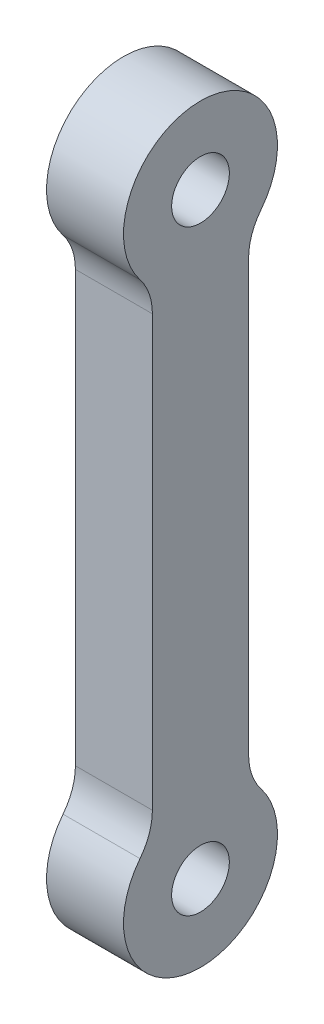
ISO-10303-21;
HEADER;
FILE_DESCRIPTION(('STEP AP214'),'2;1');
FILE_NAME('part.step','',(''),(''),'','','');
FILE_SCHEMA(('AUTOMOTIVE_DESIGN { 1 0 10303 214 1 1 1 1 }'));
ENDSEC;
DATA;
#1=APPLICATION_CONTEXT('core data for automotive mechanical design processes');
#2=APPLICATION_PROTOCOL_DEFINITION('international standard','automotive_design',2000,#1);
#3=PRODUCT_CONTEXT('',#1,'mechanical');
#4=PRODUCT('Part','Part','',(#3));
#5=PRODUCT_RELATED_PRODUCT_CATEGORY('part','',(#4));
#6=PRODUCT_DEFINITION_FORMATION('','',#4);
#7=PRODUCT_DEFINITION_CONTEXT('part definition',#1,'design');
#8=PRODUCT_DEFINITION('design','',#6,#7);
#9=PRODUCT_DEFINITION_SHAPE('','',#8);
#10=(LENGTH_UNIT() NAMED_UNIT(*) SI_UNIT(.MILLI.,.METRE.));
#11=(NAMED_UNIT(*) PLANE_ANGLE_UNIT() SI_UNIT($,.RADIAN.));
#12=(NAMED_UNIT(*) SI_UNIT($,.STERADIAN.) SOLID_ANGLE_UNIT());
#13=UNCERTAINTY_MEASURE_WITH_UNIT(LENGTH_MEASURE(1.E-05),#10,'distance_accuracy_value','');
#14=(GEOMETRIC_REPRESENTATION_CONTEXT(3) GLOBAL_UNCERTAINTY_ASSIGNED_CONTEXT((#13)) GLOBAL_UNIT_ASSIGNED_CONTEXT((#10,
#11,#12)) REPRESENTATION_CONTEXT('',''));
#15=CARTESIAN_POINT('',(0.,0.,0.));
#16=DIRECTION('',(0.,0.,1.));
#17=DIRECTION('',(1.,0.,0.));
#18=AXIS2_PLACEMENT_3D('',#15,#16,#17);
#19=CARTESIAN_POINT('',(4.,11.1698729810778,-5.5));
#20=DIRECTION('',(-1.,0.,0.));
#21=DIRECTION('',(0.,0.,1.));
#22=AXIS2_PLACEMENT_3D('',#19,#20,#21);
#23=PLANE('',#22);
#24=CARTESIAN_POINT('',(4.,11.1698729810778,-5.5));
#25=DIRECTION('',(-1.,0.,0.));
#26=DIRECTION('',(0.,0.,1.));
#27=AXIS2_PLACEMENT_3D('',#24,#25,#26);
#28=CIRCLE('',#27,3.);
#29=CARTESIAN_POINT('',(4.,11.1698729810778,-2.5));
#30=VERTEX_POINT('',#29);
#31=CARTESIAN_POINT('',(4.,13.0256417034731,-3.14285714285707));
#32=VERTEX_POINT('',#31);
#33=EDGE_CURVE('E151',#30,#32,#28,.T.);
#34=ORIENTED_EDGE('',*,*,#33,.T.);
#35=CARTESIAN_POINT('',(4.,15.5,1.08182216682588E-13));
#36=DIRECTION('',(1.,0.,0.));
#37=DIRECTION('',(0.,0.,1.));
#38=AXIS2_PLACEMENT_3D('',#35,#36,#37);
#39=CIRCLE('',#38,4.00000000000001);
#40=CARTESIAN_POINT('',(4.,13.025641703473,3.14285714285717));
#41=VERTEX_POINT('',#40);
#42=EDGE_CURVE('E99',#32,#41,#39,.T.);
#43=ORIENTED_EDGE('',*,*,#42,.T.);
#44=CARTESIAN_POINT('',(4.,11.1698729810778,5.5));
#45=DIRECTION('',(-1.,0.,0.));
#46=DIRECTION('',(0.,0.,1.));
#47=AXIS2_PLACEMENT_3D('',#44,#45,#46);
#48=CIRCLE('',#47,3.);
#49=CARTESIAN_POINT('',(4.,11.1698729810778,2.5));
#50=VERTEX_POINT('',#49);
#51=EDGE_CURVE('E166',#41,#50,#48,.T.);
#52=ORIENTED_EDGE('',*,*,#51,.T.);
#53=DIRECTION('',(0.,-1.,0.));
#54=VECTOR('',#53,1.);
#55=CARTESIAN_POINT('',(4.,11.1698729810778,2.5));
#56=LINE('',#55,#54);
#57=CARTESIAN_POINT('',(4.,-11.1698729810778,2.5));
#58=VERTEX_POINT('',#57);
#59=EDGE_CURVE('E179',#50,#58,#56,.T.);
#60=ORIENTED_EDGE('',*,*,#59,.T.);
#61=CARTESIAN_POINT('',(4.,-11.1698729810778,5.5));
#62=DIRECTION('',(-1.,0.,0.));
#63=DIRECTION('',(0.,0.,1.));
#64=AXIS2_PLACEMENT_3D('',#61,#62,#63);
#65=CIRCLE('',#64,3.);
#66=CARTESIAN_POINT('',(4.,-13.0256417034731,3.14285714285707));
#67=VERTEX_POINT('',#66);
#68=EDGE_CURVE('E118',#58,#67,#65,.T.);
#69=ORIENTED_EDGE('',*,*,#68,.T.);
#70=CARTESIAN_POINT('',(4.,-15.5,-1.08182216682588E-13));
#71=DIRECTION('',(1.,0.,0.));
#72=DIRECTION('',(0.,0.,-1.));
#73=AXIS2_PLACEMENT_3D('',#70,#71,#72);
#74=CIRCLE('',#73,4.00000000000001);
#75=CARTESIAN_POINT('',(4.,-13.025641703473,-3.14285714285717));
#76=VERTEX_POINT('',#75);
#77=EDGE_CURVE('E112',#67,#76,#74,.T.);
#78=ORIENTED_EDGE('',*,*,#77,.T.);
#79=CARTESIAN_POINT('',(4.,-11.1698729810778,-5.5));
#80=DIRECTION('',(-1.,0.,0.));
#81=DIRECTION('',(0.,0.,-1.));
#82=AXIS2_PLACEMENT_3D('',#79,#80,#81);
#83=CIRCLE('',#82,3.);
#84=CARTESIAN_POINT('',(4.,-11.1698729810778,-2.5));
#85=VERTEX_POINT('',#84);
#86=EDGE_CURVE('E116',#76,#85,#83,.T.);
#87=ORIENTED_EDGE('',*,*,#86,.T.);
#88=DIRECTION('',(0.,1.,0.));
#89=VECTOR('',#88,1.);
#90=CARTESIAN_POINT('',(4.,11.1698729810778,-2.5));
#91=LINE('',#90,#89);
#92=EDGE_CURVE('E56',#85,#30,#91,.T.);
#93=ORIENTED_EDGE('',*,*,#92,.T.);
#94=EDGE_LOOP('',(#34,#43,#52,#60,#69,#78,#87,#93));
#95=FACE_BOUND('',#94,.T.);
#96=CARTESIAN_POINT('',(4.,-15.5,-1.08182216682588E-13));
#97=DIRECTION('',(1.,0.,0.));
#98=DIRECTION('',(0.,0.,-1.));
#99=AXIS2_PLACEMENT_3D('',#96,#97,#98);
#100=CIRCLE('',#99,1.5);
#101=CARTESIAN_POINT('',(4.,-15.5,-1.50000000000011));
#102=VERTEX_POINT('',#101);
#103=EDGE_CURVE('E140',#102,#102,#100,.T.);
#104=ORIENTED_EDGE('',*,*,#103,.F.);
#105=EDGE_LOOP('',(#104));
#106=FACE_BOUND('',#105,.T.);
#107=CARTESIAN_POINT('',(4.,15.5,1.08182216682588E-13));
#108=DIRECTION('',(1.,0.,0.));
#109=DIRECTION('',(0.,0.,1.));
#110=AXIS2_PLACEMENT_3D('',#107,#108,#109);
#111=CIRCLE('',#110,1.49999999999994);
#112=CARTESIAN_POINT('',(4.,15.5,1.50000000000005));
#113=VERTEX_POINT('',#112);
#114=EDGE_CURVE('E188',#113,#113,#111,.T.);
#115=ORIENTED_EDGE('',*,*,#114,.F.);
#116=EDGE_LOOP('',(#115));
#117=FACE_BOUND('',#116,.T.);
#118=ADVANCED_FACE('F39',(#95,#106,#117),#23,.F.);
#119=CARTESIAN_POINT('',(0.,11.1698729810778,-5.5));
#120=DIRECTION('',(-1.,0.,0.));
#121=DIRECTION('',(0.,0.,1.));
#122=AXIS2_PLACEMENT_3D('',#119,#120,#121);
#123=PLANE('',#122);
#124=CARTESIAN_POINT('',(0.,-15.5,-1.08182216682588E-13));
#125=DIRECTION('',(1.,0.,0.));
#126=DIRECTION('',(0.,0.,-1.));
#127=AXIS2_PLACEMENT_3D('',#124,#125,#126);
#128=CIRCLE('',#127,1.5);
#129=CARTESIAN_POINT('',(0.,-15.5,-1.50000000000011));
#130=VERTEX_POINT('',#129);
#131=EDGE_CURVE('E185',#130,#130,#128,.T.);
#132=ORIENTED_EDGE('',*,*,#131,.T.);
#133=EDGE_LOOP('',(#132));
#134=FACE_BOUND('',#133,.T.);
#135=CARTESIAN_POINT('',(0.,11.1698729810778,-5.5));
#136=DIRECTION('',(-1.,0.,0.));
#137=DIRECTION('',(0.,0.,1.));
#138=AXIS2_PLACEMENT_3D('',#135,#136,#137);
#139=CIRCLE('',#138,3.);
#140=CARTESIAN_POINT('',(0.,11.1698729810778,-2.5));
#141=VERTEX_POINT('',#140);
#142=CARTESIAN_POINT('',(0.,13.0256417034731,-3.14285714285707));
#143=VERTEX_POINT('',#142);
#144=EDGE_CURVE('E136',#141,#143,#139,.T.);
#145=ORIENTED_EDGE('',*,*,#144,.F.);
#146=DIRECTION('',(0.,1.,0.));
#147=VECTOR('',#146,1.);
#148=CARTESIAN_POINT('',(0.,11.1698729810778,-2.5));
#149=LINE('',#148,#147);
#150=CARTESIAN_POINT('',(0.,-11.1698729810778,-2.5));
#151=VERTEX_POINT('',#150);
#152=EDGE_CURVE('E91',#151,#141,#149,.T.);
#153=ORIENTED_EDGE('',*,*,#152,.F.);
#154=CARTESIAN_POINT('',(0.,-11.1698729810778,-5.5));
#155=DIRECTION('',(-1.,0.,0.));
#156=DIRECTION('',(0.,0.,-1.));
#157=AXIS2_PLACEMENT_3D('',#154,#155,#156);
#158=CIRCLE('',#157,3.);
#159=CARTESIAN_POINT('',(0.,-13.025641703473,-3.14285714285717));
#160=VERTEX_POINT('',#159);
#161=EDGE_CURVE('E85',#160,#151,#158,.T.);
#162=ORIENTED_EDGE('',*,*,#161,.F.);
#163=CARTESIAN_POINT('',(0.,-15.5,-1.08182216682588E-13));
#164=DIRECTION('',(1.,0.,0.));
#165=DIRECTION('',(0.,0.,-1.));
#166=AXIS2_PLACEMENT_3D('',#163,#164,#165);
#167=CIRCLE('',#166,4.00000000000001);
#168=CARTESIAN_POINT('',(0.,-13.0256417034731,3.14285714285707));
#169=VERTEX_POINT('',#168);
#170=EDGE_CURVE('E126',#169,#160,#167,.T.);
#171=ORIENTED_EDGE('',*,*,#170,.F.);
#172=CARTESIAN_POINT('',(0.,-11.1698729810778,5.5));
#173=DIRECTION('',(-1.,0.,0.));
#174=DIRECTION('',(0.,0.,1.));
#175=AXIS2_PLACEMENT_3D('',#172,#173,#174);
#176=CIRCLE('',#175,3.);
#177=CARTESIAN_POINT('',(0.,-11.1698729810778,2.5));
#178=VERTEX_POINT('',#177);
#179=EDGE_CURVE('E146',#178,#169,#176,.T.);
#180=ORIENTED_EDGE('',*,*,#179,.F.);
#181=DIRECTION('',(0.,-1.,0.));
#182=VECTOR('',#181,1.);
#183=CARTESIAN_POINT('',(0.,11.1698729810778,2.5));
#184=LINE('',#183,#182);
#185=CARTESIAN_POINT('',(0.,11.1698729810778,2.5));
#186=VERTEX_POINT('',#185);
#187=EDGE_CURVE('E144',#186,#178,#184,.T.);
#188=ORIENTED_EDGE('',*,*,#187,.F.);
#189=CARTESIAN_POINT('',(0.,11.1698729810778,5.5));
#190=DIRECTION('',(-1.,0.,0.));
#191=DIRECTION('',(0.,0.,1.));
#192=AXIS2_PLACEMENT_3D('',#189,#190,#191);
#193=CIRCLE('',#192,3.);
#194=CARTESIAN_POINT('',(0.,13.025641703473,3.14285714285717));
#195=VERTEX_POINT('',#194);
#196=EDGE_CURVE('E142',#195,#186,#193,.T.);
#197=ORIENTED_EDGE('',*,*,#196,.F.);
#198=CARTESIAN_POINT('',(0.,15.5,1.08182216682588E-13));
#199=DIRECTION('',(1.,0.,0.));
#200=DIRECTION('',(0.,0.,1.));
#201=AXIS2_PLACEMENT_3D('',#198,#199,#200);
#202=CIRCLE('',#201,4.00000000000001);
#203=EDGE_CURVE('E139',#143,#195,#202,.T.);
#204=ORIENTED_EDGE('',*,*,#203,.F.);
#205=EDGE_LOOP('',(#145,#153,#162,#171,#180,#188,#197,#204));
#206=FACE_BOUND('',#205,.T.);
#207=CARTESIAN_POINT('',(0.,15.5,1.08182216682588E-13));
#208=DIRECTION('',(1.,0.,0.));
#209=DIRECTION('',(0.,0.,1.));
#210=AXIS2_PLACEMENT_3D('',#207,#208,#209);
#211=CIRCLE('',#210,1.49999999999994);
#212=CARTESIAN_POINT('',(0.,15.5,1.50000000000005));
#213=VERTEX_POINT('',#212);
#214=EDGE_CURVE('E191',#213,#213,#211,.T.);
#215=ORIENTED_EDGE('',*,*,#214,.T.);
#216=EDGE_LOOP('',(#215));
#217=FACE_BOUND('',#216,.T.);
#218=ADVANCED_FACE('F170',(#134,#206,#217),#123,.T.);
#219=CARTESIAN_POINT('',(4.,11.1698729810778,-5.5));
#220=DIRECTION('',(-1.,0.,0.));
#221=DIRECTION('',(0.,0.,1.));
#222=AXIS2_PLACEMENT_3D('',#219,#220,#221);
#223=CYLINDRICAL_SURFACE('',#222,3.);
#224=ORIENTED_EDGE('',*,*,#144,.T.);
#225=DIRECTION('',(-1.,0.,0.));
#226=VECTOR('',#225,1.);
#227=CARTESIAN_POINT('',(4.,13.0256417034731,-3.14285714285707));
#228=LINE('',#227,#226);
#229=EDGE_CURVE('E11',#32,#143,#228,.T.);
#230=ORIENTED_EDGE('',*,*,#229,.F.);
#231=ORIENTED_EDGE('',*,*,#33,.F.);
#232=DIRECTION('',(-1.,0.,0.));
#233=VECTOR('',#232,1.);
#234=CARTESIAN_POINT('',(4.,11.1698729810778,-2.5));
#235=LINE('',#234,#233);
#236=EDGE_CURVE('E132',#30,#141,#235,.T.);
#237=ORIENTED_EDGE('',*,*,#236,.T.);
#238=EDGE_LOOP('',(#224,#230,#231,#237));
#239=FACE_BOUND('',#238,.T.);
#240=ADVANCED_FACE('F41',(#239),#223,.F.);
#241=CARTESIAN_POINT('',(4.,15.5,1.08182216682588E-13));
#242=DIRECTION('',(-1.,0.,0.));
#243=DIRECTION('',(0.,0.,1.));
#244=AXIS2_PLACEMENT_3D('',#241,#242,#243);
#245=CYLINDRICAL_SURFACE('',#244,4.00000000000001);
#246=ORIENTED_EDGE('',*,*,#203,.T.);
#247=DIRECTION('',(-1.,0.,0.));
#248=VECTOR('',#247,1.);
#249=CARTESIAN_POINT('',(4.,13.025641703473,3.14285714285717));
#250=LINE('',#249,#248);
#251=EDGE_CURVE('E48',#41,#195,#250,.T.);
#252=ORIENTED_EDGE('',*,*,#251,.F.);
#253=ORIENTED_EDGE('',*,*,#42,.F.);
#254=ORIENTED_EDGE('',*,*,#229,.T.);
#255=EDGE_LOOP('',(#246,#252,#253,#254));
#256=FACE_BOUND('',#255,.T.);
#257=ADVANCED_FACE('F223',(#256),#245,.T.);
#258=CARTESIAN_POINT('',(4.,11.1698729810778,5.5));
#259=DIRECTION('',(-1.,0.,0.));
#260=DIRECTION('',(0.,0.,1.));
#261=AXIS2_PLACEMENT_3D('',#258,#259,#260);
#262=CYLINDRICAL_SURFACE('',#261,3.);
#263=ORIENTED_EDGE('',*,*,#196,.T.);
#264=DIRECTION('',(-1.,0.,0.));
#265=VECTOR('',#264,1.);
#266=CARTESIAN_POINT('',(4.,11.1698729810778,2.5));
#267=LINE('',#266,#265);
#268=EDGE_CURVE('E158',#50,#186,#267,.T.);
#269=ORIENTED_EDGE('',*,*,#268,.F.);
#270=ORIENTED_EDGE('',*,*,#51,.F.);
#271=ORIENTED_EDGE('',*,*,#251,.T.);
#272=EDGE_LOOP('',(#263,#269,#270,#271));
#273=FACE_BOUND('',#272,.T.);
#274=ADVANCED_FACE('F164',(#273),#262,.F.);
#275=CARTESIAN_POINT('',(4.,11.1698729810778,2.5));
#276=DIRECTION('',(0.,0.,-1.));
#277=DIRECTION('',(-1.,0.,0.));
#278=AXIS2_PLACEMENT_3D('',#275,#276,#277);
#279=PLANE('',#278);
#280=ORIENTED_EDGE('',*,*,#187,.T.);
#281=DIRECTION('',(-1.,0.,0.));
#282=VECTOR('',#281,1.);
#283=CARTESIAN_POINT('',(4.,-11.1698729810778,2.5));
#284=LINE('',#283,#282);
#285=EDGE_CURVE('E155',#58,#178,#284,.T.);
#286=ORIENTED_EDGE('',*,*,#285,.F.);
#287=ORIENTED_EDGE('',*,*,#59,.F.);
#288=ORIENTED_EDGE('',*,*,#268,.T.);
#289=EDGE_LOOP('',(#280,#286,#287,#288));
#290=FACE_BOUND('',#289,.T.);
#291=ADVANCED_FACE('F175',(#290),#279,.F.);
#292=CARTESIAN_POINT('',(4.,-11.1698729810778,5.5));
#293=DIRECTION('',(-1.,0.,0.));
#294=DIRECTION('',(0.,0.,1.));
#295=AXIS2_PLACEMENT_3D('',#292,#293,#294);
#296=CYLINDRICAL_SURFACE('',#295,3.);
#297=ORIENTED_EDGE('',*,*,#179,.T.);
#298=DIRECTION('',(-1.,0.,0.));
#299=VECTOR('',#298,1.);
#300=CARTESIAN_POINT('',(4.,-13.0256417034731,3.14285714285707));
#301=LINE('',#300,#299);
#302=EDGE_CURVE('E127',#67,#169,#301,.T.);
#303=ORIENTED_EDGE('',*,*,#302,.F.);
#304=ORIENTED_EDGE('',*,*,#68,.F.);
#305=ORIENTED_EDGE('',*,*,#285,.T.);
#306=EDGE_LOOP('',(#297,#303,#304,#305));
#307=FACE_BOUND('',#306,.T.);
#308=ADVANCED_FACE('F178',(#307),#296,.F.);
#309=CARTESIAN_POINT('',(4.,-15.5,-1.08182216682588E-13));
#310=DIRECTION('',(-1.,0.,0.));
#311=DIRECTION('',(0.,0.,1.));
#312=AXIS2_PLACEMENT_3D('',#309,#310,#311);
#313=CYLINDRICAL_SURFACE('',#312,4.00000000000001);
#314=ORIENTED_EDGE('',*,*,#170,.T.);
#315=DIRECTION('',(-1.,0.,0.));
#316=VECTOR('',#315,1.);
#317=CARTESIAN_POINT('',(4.,-13.025641703473,-3.14285714285717));
#318=LINE('',#317,#316);
#319=EDGE_CURVE('E123',#76,#160,#318,.T.);
#320=ORIENTED_EDGE('',*,*,#319,.F.);
#321=ORIENTED_EDGE('',*,*,#77,.F.);
#322=ORIENTED_EDGE('',*,*,#302,.T.);
#323=EDGE_LOOP('',(#314,#320,#321,#322));
#324=FACE_BOUND('',#323,.T.);
#325=ADVANCED_FACE('F124',(#324),#313,.T.);
#326=CARTESIAN_POINT('',(4.,-11.1698729810778,-5.5));
#327=DIRECTION('',(-1.,0.,0.));
#328=DIRECTION('',(0.,0.,1.));
#329=AXIS2_PLACEMENT_3D('',#326,#327,#328);
#330=CYLINDRICAL_SURFACE('',#329,3.);
#331=ORIENTED_EDGE('',*,*,#161,.T.);
#332=DIRECTION('',(-1.,0.,0.));
#333=VECTOR('',#332,1.);
#334=CARTESIAN_POINT('',(4.,-11.1698729810778,-2.5));
#335=LINE('',#334,#333);
#336=EDGE_CURVE('E128',#85,#151,#335,.T.);
#337=ORIENTED_EDGE('',*,*,#336,.F.);
#338=ORIENTED_EDGE('',*,*,#86,.F.);
#339=ORIENTED_EDGE('',*,*,#319,.T.);
#340=EDGE_LOOP('',(#331,#337,#338,#339));
#341=FACE_BOUND('',#340,.T.);
#342=ADVANCED_FACE('F130',(#341),#330,.F.);
#343=CARTESIAN_POINT('',(4.,11.1698729810778,-2.5));
#344=DIRECTION('',(0.,0.,1.));
#345=DIRECTION('',(1.,0.,0.));
#346=AXIS2_PLACEMENT_3D('',#343,#344,#345);
#347=PLANE('',#346);
#348=ORIENTED_EDGE('',*,*,#152,.T.);
#349=ORIENTED_EDGE('',*,*,#236,.F.);
#350=ORIENTED_EDGE('',*,*,#92,.F.);
#351=ORIENTED_EDGE('',*,*,#336,.T.);
#352=EDGE_LOOP('',(#348,#349,#350,#351));
#353=FACE_BOUND('',#352,.T.);
#354=ADVANCED_FACE('F211',(#353),#347,.F.);
#355=CARTESIAN_POINT('',(4.,-15.5,-1.08182216682588E-13));
#356=DIRECTION('',(-1.,0.,0.));
#357=DIRECTION('',(0.,0.,1.));
#358=AXIS2_PLACEMENT_3D('',#355,#356,#357);
#359=CYLINDRICAL_SURFACE('',#358,1.5);
#360=ORIENTED_EDGE('',*,*,#103,.T.);
#361=EDGE_LOOP('',(#360));
#362=FACE_BOUND('',#361,.T.);
#363=ORIENTED_EDGE('',*,*,#131,.F.);
#364=EDGE_LOOP('',(#363));
#365=FACE_BOUND('',#364,.T.);
#366=ADVANCED_FACE('F208',(#362,#365),#359,.F.);
#367=CARTESIAN_POINT('',(4.,15.5,1.08182216682588E-13));
#368=DIRECTION('',(-1.,0.,0.));
#369=DIRECTION('',(0.,0.,1.));
#370=AXIS2_PLACEMENT_3D('',#367,#368,#369);
#371=CYLINDRICAL_SURFACE('',#370,1.49999999999994);
#372=ORIENTED_EDGE('',*,*,#114,.T.);
#373=EDGE_LOOP('',(#372));
#374=FACE_BOUND('',#373,.T.);
#375=ORIENTED_EDGE('',*,*,#214,.F.);
#376=EDGE_LOOP('',(#375));
#377=FACE_BOUND('',#376,.T.);
#378=ADVANCED_FACE('F197',(#374,#377),#371,.F.);
#379=CLOSED_SHELL('',(#118,#218,#240,#257,#274,#291,#308,#325,#342,#354,#366,#378));
#380=MANIFOLD_SOLID_BREP('B2',#379);
#381=ADVANCED_BREP_SHAPE_REPRESENTATION('',(#18,#380),#14);
#382=SHAPE_DEFINITION_REPRESENTATION(#9,#381);
ENDSEC;
END-ISO-10303-21;
